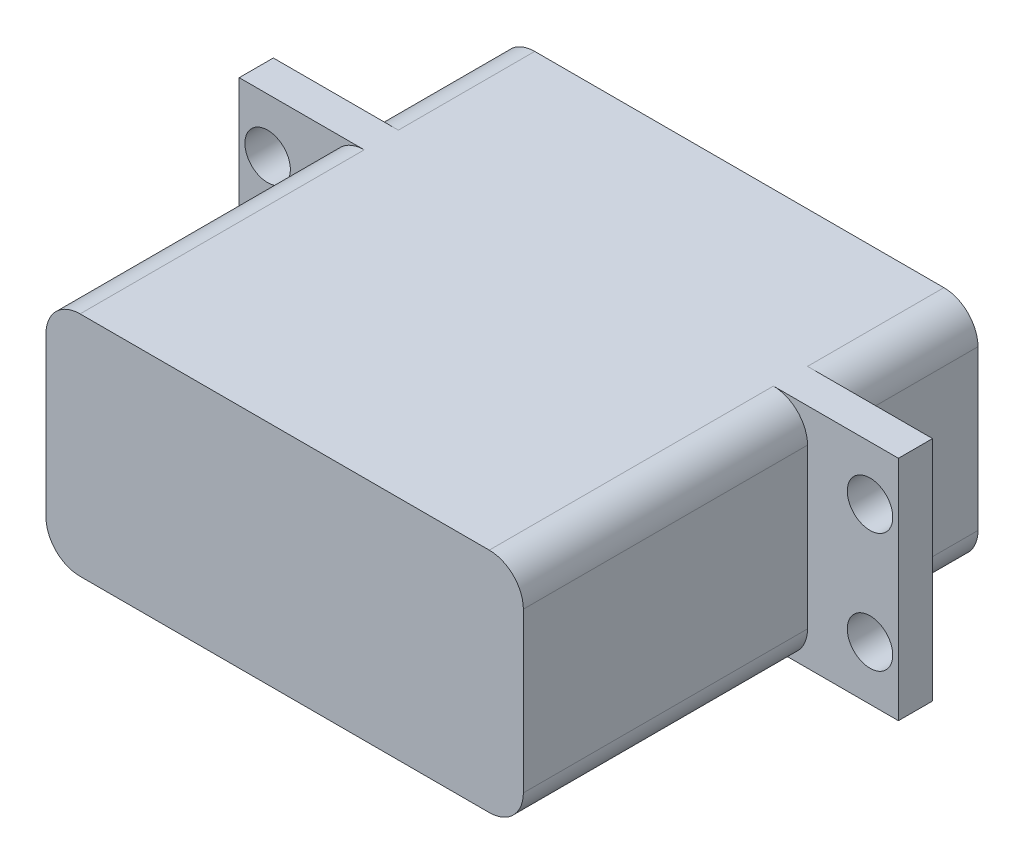
ISO-10303-21;
HEADER;
FILE_DESCRIPTION(('STEP AP214'),'2;1');
FILE_NAME('part.step','',(''),(''),'','','');
FILE_SCHEMA(('AUTOMOTIVE_DESIGN { 1 0 10303 214 1 1 1 1 }'));
ENDSEC;
DATA;
#1=APPLICATION_CONTEXT('core data for automotive mechanical design processes');
#2=APPLICATION_PROTOCOL_DEFINITION('international standard','automotive_design',2000,#1);
#3=PRODUCT_CONTEXT('',#1,'mechanical');
#4=PRODUCT('Part','Part','',(#3));
#5=PRODUCT_RELATED_PRODUCT_CATEGORY('part','',(#4));
#6=PRODUCT_DEFINITION_FORMATION('','',#4);
#7=PRODUCT_DEFINITION_CONTEXT('part definition',#1,'design');
#8=PRODUCT_DEFINITION('design','',#6,#7);
#9=PRODUCT_DEFINITION_SHAPE('','',#8);
#10=(LENGTH_UNIT() NAMED_UNIT(*) SI_UNIT(.MILLI.,.METRE.));
#11=(NAMED_UNIT(*) PLANE_ANGLE_UNIT() SI_UNIT($,.RADIAN.));
#12=(NAMED_UNIT(*) SI_UNIT($,.STERADIAN.) SOLID_ANGLE_UNIT());
#13=UNCERTAINTY_MEASURE_WITH_UNIT(LENGTH_MEASURE(1.E-05),#10,'distance_accuracy_value','');
#14=(GEOMETRIC_REPRESENTATION_CONTEXT(3) GLOBAL_UNCERTAINTY_ASSIGNED_CONTEXT((#13)) GLOBAL_UNIT_ASSIGNED_CONTEXT((#10,
#11,#12)) REPRESENTATION_CONTEXT('',''));
#15=CARTESIAN_POINT('',(0.,0.,0.));
#16=DIRECTION('',(0.,0.,1.));
#17=DIRECTION('',(1.,0.,0.));
#18=AXIS2_PLACEMENT_3D('',#15,#16,#17);
#19=CARTESIAN_POINT('',(39.,-17.,40.));
#20=DIRECTION('',(0.,0.,-1.));
#21=DIRECTION('',(-1.,0.,0.));
#22=AXIS2_PLACEMENT_3D('',#19,#20,#21);
#23=CYLINDRICAL_SURFACE('',#22,3.);
#24=CARTESIAN_POINT('',(39.,-17.,15.));
#25=DIRECTION('',(0.,0.,-1.));
#26=DIRECTION('',(-1.,0.,0.));
#27=AXIS2_PLACEMENT_3D('',#24,#25,#26);
#28=CIRCLE('',#27,3.);
#29=CARTESIAN_POINT('',(42.,-17.,15.));
#30=VERTEX_POINT('',#29);
#31=CARTESIAN_POINT('',(39.,-20.,15.));
#32=VERTEX_POINT('',#31);
#33=EDGE_CURVE('E56',#30,#32,#28,.T.);
#34=ORIENTED_EDGE('',*,*,#33,.F.);
#35=DIRECTION('',(0.,0.,-1.));
#36=VECTOR('',#35,1.);
#37=CARTESIAN_POINT('',(42.,-17.,40.));
#38=LINE('',#37,#36);
#39=CARTESIAN_POINT('',(42.,-17.,40.));
#40=VERTEX_POINT('',#39);
#41=EDGE_CURVE('E41',#40,#30,#38,.T.);
#42=ORIENTED_EDGE('',*,*,#41,.F.);
#43=CARTESIAN_POINT('',(39.,-17.,40.));
#44=DIRECTION('',(0.,0.,1.));
#45=DIRECTION('',(1.,0.,0.));
#46=AXIS2_PLACEMENT_3D('',#43,#44,#45);
#47=CIRCLE('',#46,3.);
#48=CARTESIAN_POINT('',(39.,-20.,40.));
#49=VERTEX_POINT('',#48);
#50=EDGE_CURVE('E251',#49,#40,#47,.T.);
#51=ORIENTED_EDGE('',*,*,#50,.F.);
#52=DIRECTION('',(0.,0.,-1.));
#53=VECTOR('',#52,1.);
#54=CARTESIAN_POINT('',(39.,-20.,40.));
#55=LINE('',#54,#53);
#56=EDGE_CURVE('E291',#49,#32,#55,.T.);
#57=ORIENTED_EDGE('',*,*,#56,.T.);
#58=EDGE_LOOP('',(#34,#42,#51,#57));
#59=FACE_BOUND('',#58,.T.);
#60=ADVANCED_FACE('F33',(#59),#23,.T.);
#61=CARTESIAN_POINT('',(42.,-3.00000000000002,40.));
#62=DIRECTION('',(-1.,0.,0.));
#63=DIRECTION('',(0.,0.,1.));
#64=AXIS2_PLACEMENT_3D('',#61,#62,#63);
#65=PLANE('',#64);
#66=DIRECTION('',(0.,-1.,0.));
#67=VECTOR('',#66,1.);
#68=CARTESIAN_POINT('',(42.,-3.00000000000002,15.));
#69=LINE('',#68,#67);
#70=CARTESIAN_POINT('',(42.,-3.00000000000002,15.));
#71=VERTEX_POINT('',#70);
#72=EDGE_CURVE('E351',#71,#30,#69,.T.);
#73=ORIENTED_EDGE('',*,*,#72,.F.);
#74=DIRECTION('',(0.,0.,-1.));
#75=VECTOR('',#74,1.);
#76=CARTESIAN_POINT('',(42.,-3.00000000000002,40.));
#77=LINE('',#76,#75);
#78=CARTESIAN_POINT('',(42.,-3.00000000000002,40.));
#79=VERTEX_POINT('',#78);
#80=EDGE_CURVE('E314',#79,#71,#77,.T.);
#81=ORIENTED_EDGE('',*,*,#80,.F.);
#82=DIRECTION('',(0.,1.,0.));
#83=VECTOR('',#82,1.);
#84=CARTESIAN_POINT('',(42.,-3.00000000000002,40.));
#85=LINE('',#84,#83);
#86=EDGE_CURVE('E254',#40,#79,#85,.T.);
#87=ORIENTED_EDGE('',*,*,#86,.F.);
#88=ORIENTED_EDGE('',*,*,#41,.T.);
#89=EDGE_LOOP('',(#73,#81,#87,#88));
#90=FACE_BOUND('',#89,.T.);
#91=ADVANCED_FACE('F407',(#90),#65,.F.);
#92=CARTESIAN_POINT('',(39.,-3.,40.));
#93=DIRECTION('',(0.,0.,-1.));
#94=DIRECTION('',(-1.,0.,0.));
#95=AXIS2_PLACEMENT_3D('',#92,#93,#94);
#96=CYLINDRICAL_SURFACE('',#95,3.);
#97=CARTESIAN_POINT('',(39.,-3.00000000000002,15.));
#98=DIRECTION('',(0.,0.,-1.));
#99=DIRECTION('',(-1.,0.,0.));
#100=AXIS2_PLACEMENT_3D('',#97,#98,#99);
#101=CIRCLE('',#100,3.00000000000002);
#102=CARTESIAN_POINT('',(39.,0.,15.));
#103=VERTEX_POINT('',#102);
#104=EDGE_CURVE('E215',#103,#71,#101,.T.);
#105=ORIENTED_EDGE('',*,*,#104,.F.);
#106=DIRECTION('',(0.,0.,-1.));
#107=VECTOR('',#106,1.);
#108=CARTESIAN_POINT('',(39.,0.,40.));
#109=LINE('',#108,#107);
#110=CARTESIAN_POINT('',(39.,0.,40.));
#111=VERTEX_POINT('',#110);
#112=EDGE_CURVE('E310',#111,#103,#109,.T.);
#113=ORIENTED_EDGE('',*,*,#112,.F.);
#114=CARTESIAN_POINT('',(39.,-3.,40.));
#115=DIRECTION('',(0.,0.,1.));
#116=DIRECTION('',(-1.,0.,0.));
#117=AXIS2_PLACEMENT_3D('',#114,#115,#116);
#118=CIRCLE('',#117,3.);
#119=EDGE_CURVE('E257',#79,#111,#118,.T.);
#120=ORIENTED_EDGE('',*,*,#119,.F.);
#121=ORIENTED_EDGE('',*,*,#80,.T.);
#122=EDGE_LOOP('',(#105,#113,#120,#121));
#123=FACE_BOUND('',#122,.T.);
#124=ADVANCED_FACE('F411',(#123),#96,.T.);
#125=CARTESIAN_POINT('',(3.,-3.,40.));
#126=DIRECTION('',(0.,0.,-1.));
#127=DIRECTION('',(-1.,0.,0.));
#128=AXIS2_PLACEMENT_3D('',#125,#126,#127);
#129=CYLINDRICAL_SURFACE('',#128,3.);
#130=CARTESIAN_POINT('',(3.00000000000002,-3.00000000000002,12.));
#131=DIRECTION('',(0.,0.,-1.));
#132=DIRECTION('',(1.,0.,0.));
#133=AXIS2_PLACEMENT_3D('',#130,#131,#132);
#134=CIRCLE('',#133,3.00000000000002);
#135=CARTESIAN_POINT('',(0.,-3.00000000000002,12.));
#136=VERTEX_POINT('',#135);
#137=CARTESIAN_POINT('',(3.00000000000002,0.,12.));
#138=VERTEX_POINT('',#137);
#139=EDGE_CURVE('E236',#136,#138,#134,.T.);
#140=ORIENTED_EDGE('',*,*,#139,.T.);
#141=DIRECTION('',(0.,0.,-1.));
#142=VECTOR('',#141,1.);
#143=CARTESIAN_POINT('',(3.00000000000002,0.,40.));
#144=LINE('',#143,#142);
#145=CARTESIAN_POINT('',(3.00000000000002,0.,0.));
#146=VERTEX_POINT('',#145);
#147=EDGE_CURVE('E305',#138,#146,#144,.T.);
#148=ORIENTED_EDGE('',*,*,#147,.T.);
#149=CARTESIAN_POINT('',(3.,-3.,0.));
#150=DIRECTION('',(0.,0.,1.));
#151=DIRECTION('',(1.,0.,0.));
#152=AXIS2_PLACEMENT_3D('',#149,#150,#151);
#153=CIRCLE('',#152,3.);
#154=CARTESIAN_POINT('',(0.,-3.00000000000002,0.));
#155=VERTEX_POINT('',#154);
#156=EDGE_CURVE('E281',#146,#155,#153,.T.);
#157=ORIENTED_EDGE('',*,*,#156,.T.);
#158=DIRECTION('',(0.,0.,-1.));
#159=VECTOR('',#158,1.);
#160=CARTESIAN_POINT('',(0.,-3.00000000000002,40.));
#161=LINE('',#160,#159);
#162=EDGE_CURVE('E301',#136,#155,#161,.T.);
#163=ORIENTED_EDGE('',*,*,#162,.F.);
#164=EDGE_LOOP('',(#140,#148,#157,#163));
#165=FACE_BOUND('',#164,.T.);
#166=ADVANCED_FACE('F339',(#165),#129,.T.);
#167=CARTESIAN_POINT('',(0.,-3.00000000000002,40.));
#168=DIRECTION('',(1.,0.,0.));
#169=DIRECTION('',(0.,1.,0.));
#170=AXIS2_PLACEMENT_3D('',#167,#168,#169);
#171=PLANE('',#170);
#172=DIRECTION('',(0.,1.,0.));
#173=VECTOR('',#172,1.);
#174=CARTESIAN_POINT('',(0.,-3.00000000000002,12.));
#175=LINE('',#174,#173);
#176=CARTESIAN_POINT('',(0.,-17.,12.));
#177=VERTEX_POINT('',#176);
#178=EDGE_CURVE('E233',#177,#136,#175,.T.);
#179=ORIENTED_EDGE('',*,*,#178,.T.);
#180=ORIENTED_EDGE('',*,*,#162,.T.);
#181=DIRECTION('',(0.,-1.,0.));
#182=VECTOR('',#181,1.);
#183=CARTESIAN_POINT('',(0.,-3.00000000000002,0.));
#184=LINE('',#183,#182);
#185=CARTESIAN_POINT('',(0.,-17.,0.));
#186=VERTEX_POINT('',#185);
#187=EDGE_CURVE('E284',#155,#186,#184,.T.);
#188=ORIENTED_EDGE('',*,*,#187,.T.);
#189=DIRECTION('',(0.,0.,-1.));
#190=VECTOR('',#189,1.);
#191=CARTESIAN_POINT('',(0.,-17.,40.));
#192=LINE('',#191,#190);
#193=EDGE_CURVE('E297',#177,#186,#192,.T.);
#194=ORIENTED_EDGE('',*,*,#193,.F.);
#195=EDGE_LOOP('',(#179,#180,#188,#194));
#196=FACE_BOUND('',#195,.T.);
#197=ADVANCED_FACE('F336',(#196),#171,.F.);
#198=CARTESIAN_POINT('',(3.,-17.,40.));
#199=DIRECTION('',(0.,0.,-1.));
#200=DIRECTION('',(-1.,0.,0.));
#201=AXIS2_PLACEMENT_3D('',#198,#199,#200);
#202=CYLINDRICAL_SURFACE('',#201,3.);
#203=CARTESIAN_POINT('',(3.,-17.,12.));
#204=DIRECTION('',(0.,0.,-1.));
#205=DIRECTION('',(1.,0.,0.));
#206=AXIS2_PLACEMENT_3D('',#203,#204,#205);
#207=CIRCLE('',#206,3.);
#208=CARTESIAN_POINT('',(3.00000000000002,-20.,12.));
#209=VERTEX_POINT('',#208);
#210=EDGE_CURVE('E191',#209,#177,#207,.T.);
#211=ORIENTED_EDGE('',*,*,#210,.T.);
#212=ORIENTED_EDGE('',*,*,#193,.T.);
#213=CARTESIAN_POINT('',(3.,-17.,0.));
#214=DIRECTION('',(0.,0.,1.));
#215=DIRECTION('',(-1.,0.,0.));
#216=AXIS2_PLACEMENT_3D('',#213,#214,#215);
#217=CIRCLE('',#216,3.);
#218=CARTESIAN_POINT('',(3.00000000000002,-20.,0.));
#219=VERTEX_POINT('',#218);
#220=EDGE_CURVE('E287',#186,#219,#217,.T.);
#221=ORIENTED_EDGE('',*,*,#220,.T.);
#222=DIRECTION('',(0.,0.,-1.));
#223=VECTOR('',#222,1.);
#224=CARTESIAN_POINT('',(3.00000000000002,-20.,40.));
#225=LINE('',#224,#223);
#226=EDGE_CURVE('E293',#209,#219,#225,.T.);
#227=ORIENTED_EDGE('',*,*,#226,.F.);
#228=EDGE_LOOP('',(#211,#212,#221,#227));
#229=FACE_BOUND('',#228,.T.);
#230=ADVANCED_FACE('F333',(#229),#202,.T.);
#231=CARTESIAN_POINT('',(42.,-17.,12.));
#232=VERTEX_POINT('',#231);
#233=CARTESIAN_POINT('',(42.,-17.,0.));
#234=VERTEX_POINT('',#233);
#235=EDGE_CURVE('E316',#232,#234,#38,.T.);
#236=ORIENTED_EDGE('',*,*,#235,.F.);
#237=CARTESIAN_POINT('',(39.,-17.,12.));
#238=DIRECTION('',(0.,0.,-1.));
#239=DIRECTION('',(-1.,0.,0.));
#240=AXIS2_PLACEMENT_3D('',#237,#238,#239);
#241=CIRCLE('',#240,3.);
#242=CARTESIAN_POINT('',(39.,-20.,12.));
#243=VERTEX_POINT('',#242);
#244=EDGE_CURVE('E206',#232,#243,#241,.T.);
#245=ORIENTED_EDGE('',*,*,#244,.T.);
#246=CARTESIAN_POINT('',(39.,-20.,0.));
#247=VERTEX_POINT('',#246);
#248=EDGE_CURVE('E269',#243,#247,#55,.T.);
#249=ORIENTED_EDGE('',*,*,#248,.T.);
#250=CARTESIAN_POINT('',(39.,-17.,0.));
#251=DIRECTION('',(0.,0.,1.));
#252=DIRECTION('',(1.,0.,0.));
#253=AXIS2_PLACEMENT_3D('',#250,#251,#252);
#254=CIRCLE('',#253,3.);
#255=EDGE_CURVE('E250',#247,#234,#254,.T.);
#256=ORIENTED_EDGE('',*,*,#255,.T.);
#257=EDGE_LOOP('',(#236,#245,#249,#256));
#258=FACE_BOUND('',#257,.T.);
#259=ADVANCED_FACE('F35',(#258),#23,.T.);
#260=CARTESIAN_POINT('',(42.,-3.00000000000002,12.));
#261=VERTEX_POINT('',#260);
#262=CARTESIAN_POINT('',(42.,-3.00000000000002,0.));
#263=VERTEX_POINT('',#262);
#264=EDGE_CURVE('E313',#261,#263,#77,.T.);
#265=ORIENTED_EDGE('',*,*,#264,.F.);
#266=DIRECTION('',(0.,-1.,0.));
#267=VECTOR('',#266,1.);
#268=CARTESIAN_POINT('',(42.,-3.00000000000002,12.));
#269=LINE('',#268,#267);
#270=EDGE_CURVE('E48',#261,#232,#269,.T.);
#271=ORIENTED_EDGE('',*,*,#270,.T.);
#272=ORIENTED_EDGE('',*,*,#235,.T.);
#273=DIRECTION('',(0.,1.,0.));
#274=VECTOR('',#273,1.);
#275=CARTESIAN_POINT('',(42.,-3.00000000000002,0.));
#276=LINE('',#275,#274);
#277=EDGE_CURVE('E272',#234,#263,#276,.T.);
#278=ORIENTED_EDGE('',*,*,#277,.T.);
#279=EDGE_LOOP('',(#265,#271,#272,#278));
#280=FACE_BOUND('',#279,.T.);
#281=ADVANCED_FACE('F319',(#280),#65,.F.);
#282=CARTESIAN_POINT('',(39.,0.,12.));
#283=VERTEX_POINT('',#282);
#284=CARTESIAN_POINT('',(39.,0.,0.));
#285=VERTEX_POINT('',#284);
#286=EDGE_CURVE('E309',#283,#285,#109,.T.);
#287=ORIENTED_EDGE('',*,*,#286,.F.);
#288=CARTESIAN_POINT('',(39.,-3.00000000000002,12.));
#289=DIRECTION('',(0.,0.,-1.));
#290=DIRECTION('',(-1.,0.,0.));
#291=AXIS2_PLACEMENT_3D('',#288,#289,#290);
#292=CIRCLE('',#291,3.00000000000002);
#293=EDGE_CURVE('E202',#283,#261,#292,.T.);
#294=ORIENTED_EDGE('',*,*,#293,.T.);
#295=ORIENTED_EDGE('',*,*,#264,.T.);
#296=CARTESIAN_POINT('',(39.,-3.,0.));
#297=DIRECTION('',(0.,0.,1.));
#298=DIRECTION('',(-1.,0.,0.));
#299=AXIS2_PLACEMENT_3D('',#296,#297,#298);
#300=CIRCLE('',#299,3.);
#301=EDGE_CURVE('E275',#263,#285,#300,.T.);
#302=ORIENTED_EDGE('',*,*,#301,.T.);
#303=EDGE_LOOP('',(#287,#294,#295,#302));
#304=FACE_BOUND('',#303,.T.);
#305=ADVANCED_FACE('F346',(#304),#96,.T.);
#306=CARTESIAN_POINT('',(3.00000000000002,0.,40.));
#307=DIRECTION('',(0.,-1.,0.));
#308=DIRECTION('',(0.,0.,-1.));
#309=AXIS2_PLACEMENT_3D('',#306,#307,#308);
#310=PLANE('',#309);
#311=DIRECTION('',(-1.,0.,0.));
#312=VECTOR('',#311,1.);
#313=CARTESIAN_POINT('',(3.00000000000002,0.,0.));
#314=LINE('',#313,#312);
#315=EDGE_CURVE('E278',#285,#146,#314,.T.);
#316=ORIENTED_EDGE('',*,*,#315,.T.);
#317=ORIENTED_EDGE('',*,*,#147,.F.);
#318=DIRECTION('',(-1.,0.,0.));
#319=VECTOR('',#318,1.);
#320=CARTESIAN_POINT('',(3.00000000000002,0.,12.));
#321=LINE('',#320,#319);
#322=CARTESIAN_POINT('',(-8.,0.,12.));
#323=VERTEX_POINT('',#322);
#324=EDGE_CURVE('E239',#138,#323,#321,.T.);
#325=ORIENTED_EDGE('',*,*,#324,.T.);
#326=DIRECTION('',(0.,0.,-1.));
#327=VECTOR('',#326,1.);
#328=CARTESIAN_POINT('',(-8.,0.,15.));
#329=LINE('',#328,#327);
#330=CARTESIAN_POINT('',(-8.,0.,15.));
#331=VERTEX_POINT('',#330);
#332=EDGE_CURVE('E247',#331,#323,#329,.T.);
#333=ORIENTED_EDGE('',*,*,#332,.F.);
#334=DIRECTION('',(-1.,0.,0.));
#335=VECTOR('',#334,1.);
#336=CARTESIAN_POINT('',(3.00000000000002,0.,15.));
#337=LINE('',#336,#335);
#338=CARTESIAN_POINT('',(3.00000000000002,0.,15.));
#339=VERTEX_POINT('',#338);
#340=EDGE_CURVE('E224',#339,#331,#337,.T.);
#341=ORIENTED_EDGE('',*,*,#340,.F.);
#342=CARTESIAN_POINT('',(3.00000000000002,0.,40.));
#343=VERTEX_POINT('',#342);
#344=EDGE_CURVE('E306',#343,#339,#144,.T.);
#345=ORIENTED_EDGE('',*,*,#344,.F.);
#346=DIRECTION('',(-1.,0.,0.));
#347=VECTOR('',#346,1.);
#348=CARTESIAN_POINT('',(3.00000000000002,0.,40.));
#349=LINE('',#348,#347);
#350=EDGE_CURVE('E259',#111,#343,#349,.T.);
#351=ORIENTED_EDGE('',*,*,#350,.F.);
#352=ORIENTED_EDGE('',*,*,#112,.T.);
#353=DIRECTION('',(-1.,0.,0.));
#354=VECTOR('',#353,1.);
#355=CARTESIAN_POINT('',(39.,0.,15.));
#356=LINE('',#355,#354);
#357=CARTESIAN_POINT('',(50.,0.,15.));
#358=VERTEX_POINT('',#357);
#359=EDGE_CURVE('E197',#358,#103,#356,.T.);
#360=ORIENTED_EDGE('',*,*,#359,.F.);
#361=DIRECTION('',(0.,0.,-1.));
#362=VECTOR('',#361,1.);
#363=CARTESIAN_POINT('',(50.,0.,15.));
#364=LINE('',#363,#362);
#365=CARTESIAN_POINT('',(50.,0.,12.));
#366=VERTEX_POINT('',#365);
#367=EDGE_CURVE('E192',#358,#366,#364,.T.);
#368=ORIENTED_EDGE('',*,*,#367,.T.);
#369=DIRECTION('',(-1.,0.,0.));
#370=VECTOR('',#369,1.);
#371=CARTESIAN_POINT('',(39.,0.,12.));
#372=LINE('',#371,#370);
#373=EDGE_CURVE('E212',#366,#283,#372,.T.);
#374=ORIENTED_EDGE('',*,*,#373,.T.);
#375=ORIENTED_EDGE('',*,*,#286,.T.);
#376=EDGE_LOOP('',(#316,#317,#325,#333,#341,#345,#351,#352,#360,#368,#374,#375));
#377=FACE_BOUND('',#376,.T.);
#378=ADVANCED_FACE('F342',(#377),#310,.F.);
#379=ORIENTED_EDGE('',*,*,#344,.T.);
#380=CARTESIAN_POINT('',(3.00000000000002,-3.00000000000002,15.));
#381=DIRECTION('',(0.,0.,-1.));
#382=DIRECTION('',(1.,0.,0.));
#383=AXIS2_PLACEMENT_3D('',#380,#381,#382);
#384=CIRCLE('',#383,3.00000000000002);
#385=CARTESIAN_POINT('',(0.,-3.00000000000002,15.));
#386=VERTEX_POINT('',#385);
#387=EDGE_CURVE('E222',#386,#339,#384,.T.);
#388=ORIENTED_EDGE('',*,*,#387,.F.);
#389=CARTESIAN_POINT('',(0.,-3.00000000000002,40.));
#390=VERTEX_POINT('',#389);
#391=EDGE_CURVE('E302',#390,#386,#161,.T.);
#392=ORIENTED_EDGE('',*,*,#391,.F.);
#393=CARTESIAN_POINT('',(3.,-3.,40.));
#394=DIRECTION('',(0.,0.,1.));
#395=DIRECTION('',(1.,0.,0.));
#396=AXIS2_PLACEMENT_3D('',#393,#394,#395);
#397=CIRCLE('',#396,3.);
#398=EDGE_CURVE('E261',#343,#390,#397,.T.);
#399=ORIENTED_EDGE('',*,*,#398,.F.);
#400=EDGE_LOOP('',(#379,#388,#392,#399));
#401=FACE_BOUND('',#400,.T.);
#402=ADVANCED_FACE('F430',(#401),#129,.T.);
#403=ORIENTED_EDGE('',*,*,#391,.T.);
#404=DIRECTION('',(0.,1.,0.));
#405=VECTOR('',#404,1.);
#406=CARTESIAN_POINT('',(0.,-3.00000000000002,15.));
#407=LINE('',#406,#405);
#408=CARTESIAN_POINT('',(0.,-17.,15.));
#409=VERTEX_POINT('',#408);
#410=EDGE_CURVE('E219',#409,#386,#407,.T.);
#411=ORIENTED_EDGE('',*,*,#410,.F.);
#412=CARTESIAN_POINT('',(0.,-17.,40.));
#413=VERTEX_POINT('',#412);
#414=EDGE_CURVE('E298',#413,#409,#192,.T.);
#415=ORIENTED_EDGE('',*,*,#414,.F.);
#416=DIRECTION('',(0.,-1.,0.));
#417=VECTOR('',#416,1.);
#418=CARTESIAN_POINT('',(0.,-3.00000000000002,40.));
#419=LINE('',#418,#417);
#420=EDGE_CURVE('E263',#390,#413,#419,.T.);
#421=ORIENTED_EDGE('',*,*,#420,.F.);
#422=EDGE_LOOP('',(#403,#411,#415,#421));
#423=FACE_BOUND('',#422,.T.);
#424=ADVANCED_FACE('F423',(#423),#171,.F.);
#425=ORIENTED_EDGE('',*,*,#414,.T.);
#426=CARTESIAN_POINT('',(3.,-17.,15.));
#427=DIRECTION('',(0.,0.,-1.));
#428=DIRECTION('',(1.,0.,0.));
#429=AXIS2_PLACEMENT_3D('',#426,#427,#428);
#430=CIRCLE('',#429,3.);
#431=CARTESIAN_POINT('',(3.00000000000002,-20.,15.));
#432=VERTEX_POINT('',#431);
#433=EDGE_CURVE('E217',#432,#409,#430,.T.);
#434=ORIENTED_EDGE('',*,*,#433,.F.);
#435=CARTESIAN_POINT('',(3.00000000000002,-20.,40.));
#436=VERTEX_POINT('',#435);
#437=EDGE_CURVE('E294',#436,#432,#225,.T.);
#438=ORIENTED_EDGE('',*,*,#437,.F.);
#439=CARTESIAN_POINT('',(3.,-17.,40.));
#440=DIRECTION('',(0.,0.,1.));
#441=DIRECTION('',(-1.,0.,0.));
#442=AXIS2_PLACEMENT_3D('',#439,#440,#441);
#443=CIRCLE('',#442,3.);
#444=EDGE_CURVE('E265',#413,#436,#443,.T.);
#445=ORIENTED_EDGE('',*,*,#444,.F.);
#446=EDGE_LOOP('',(#425,#434,#438,#445));
#447=FACE_BOUND('',#446,.T.);
#448=ADVANCED_FACE('F418',(#447),#202,.T.);
#449=CARTESIAN_POINT('',(3.00000000000002,-20.,40.));
#450=DIRECTION('',(0.,1.,0.));
#451=DIRECTION('',(0.,0.,1.));
#452=AXIS2_PLACEMENT_3D('',#449,#450,#451);
#453=PLANE('',#452);
#454=DIRECTION('',(1.,0.,0.));
#455=VECTOR('',#454,1.);
#456=CARTESIAN_POINT('',(3.00000000000002,-20.,0.));
#457=LINE('',#456,#455);
#458=EDGE_CURVE('E255',#219,#247,#457,.T.);
#459=ORIENTED_EDGE('',*,*,#458,.T.);
#460=ORIENTED_EDGE('',*,*,#248,.F.);
#461=DIRECTION('',(1.,0.,0.));
#462=VECTOR('',#461,1.);
#463=CARTESIAN_POINT('',(50.,-20.,12.));
#464=LINE('',#463,#462);
#465=CARTESIAN_POINT('',(50.,-20.,12.));
#466=VERTEX_POINT('',#465);
#467=EDGE_CURVE('E188',#243,#466,#464,.T.);
#468=ORIENTED_EDGE('',*,*,#467,.T.);
#469=DIRECTION('',(0.,0.,-1.));
#470=VECTOR('',#469,1.);
#471=CARTESIAN_POINT('',(50.,-20.,15.));
#472=LINE('',#471,#470);
#473=CARTESIAN_POINT('',(50.,-20.,15.));
#474=VERTEX_POINT('',#473);
#475=EDGE_CURVE('E184',#474,#466,#472,.T.);
#476=ORIENTED_EDGE('',*,*,#475,.F.);
#477=DIRECTION('',(1.,0.,0.));
#478=VECTOR('',#477,1.);
#479=CARTESIAN_POINT('',(50.,-20.,15.));
#480=LINE('',#479,#478);
#481=EDGE_CURVE('E171',#32,#474,#480,.T.);
#482=ORIENTED_EDGE('',*,*,#481,.F.);
#483=ORIENTED_EDGE('',*,*,#56,.F.);
#484=DIRECTION('',(1.,0.,0.));
#485=VECTOR('',#484,1.);
#486=CARTESIAN_POINT('',(3.00000000000002,-20.,40.));
#487=LINE('',#486,#485);
#488=EDGE_CURVE('E267',#436,#49,#487,.T.);
#489=ORIENTED_EDGE('',*,*,#488,.F.);
#490=ORIENTED_EDGE('',*,*,#437,.T.);
#491=DIRECTION('',(1.,0.,0.));
#492=VECTOR('',#491,1.);
#493=CARTESIAN_POINT('',(-8.,-20.,15.));
#494=LINE('',#493,#492);
#495=CARTESIAN_POINT('',(-8.,-20.,15.));
#496=VERTEX_POINT('',#495);
#497=EDGE_CURVE('E228',#496,#432,#494,.T.);
#498=ORIENTED_EDGE('',*,*,#497,.F.);
#499=DIRECTION('',(0.,0.,-1.));
#500=VECTOR('',#499,1.);
#501=CARTESIAN_POINT('',(-8.,-20.,15.));
#502=LINE('',#501,#500);
#503=CARTESIAN_POINT('',(-8.,-20.,12.));
#504=VERTEX_POINT('',#503);
#505=EDGE_CURVE('E230',#496,#504,#502,.T.);
#506=ORIENTED_EDGE('',*,*,#505,.T.);
#507=DIRECTION('',(1.,0.,0.));
#508=VECTOR('',#507,1.);
#509=CARTESIAN_POINT('',(-8.,-20.,12.));
#510=LINE('',#509,#508);
#511=EDGE_CURVE('E220',#504,#209,#510,.T.);
#512=ORIENTED_EDGE('',*,*,#511,.T.);
#513=ORIENTED_EDGE('',*,*,#226,.T.);
#514=EDGE_LOOP('',(#459,#460,#468,#476,#482,#483,#489,#490,#498,#506,#512,#513));
#515=FACE_BOUND('',#514,.T.);
#516=ADVANCED_FACE('F186',(#515),#453,.F.);
#517=CARTESIAN_POINT('',(39.,-17.,40.));
#518=DIRECTION('',(0.,0.,1.));
#519=DIRECTION('',(1.,0.,0.));
#520=AXIS2_PLACEMENT_3D('',#517,#518,#519);
#521=PLANE('',#520);
#522=ORIENTED_EDGE('',*,*,#50,.T.);
#523=ORIENTED_EDGE('',*,*,#86,.T.);
#524=ORIENTED_EDGE('',*,*,#119,.T.);
#525=ORIENTED_EDGE('',*,*,#350,.T.);
#526=ORIENTED_EDGE('',*,*,#398,.T.);
#527=ORIENTED_EDGE('',*,*,#420,.T.);
#528=ORIENTED_EDGE('',*,*,#444,.T.);
#529=ORIENTED_EDGE('',*,*,#488,.T.);
#530=EDGE_LOOP('',(#522,#523,#524,#525,#526,#527,#528,#529));
#531=FACE_BOUND('',#530,.T.);
#532=ADVANCED_FACE('F394',(#531),#521,.T.);
#533=CARTESIAN_POINT('',(39.,-17.,0.));
#534=DIRECTION('',(0.,0.,1.));
#535=DIRECTION('',(1.,0.,0.));
#536=AXIS2_PLACEMENT_3D('',#533,#534,#535);
#537=PLANE('',#536);
#538=CARTESIAN_POINT('',(10.,-10.,0.));
#539=DIRECTION('',(0.,0.,1.));
#540=DIRECTION('',(1.,0.,0.));
#541=AXIS2_PLACEMENT_3D('',#538,#539,#540);
#542=CIRCLE('',#541,3.);
#543=CARTESIAN_POINT('',(13.,-10.,0.));
#544=VERTEX_POINT('',#543);
#545=EDGE_CURVE('E11',#544,#544,#542,.F.);
#546=ORIENTED_EDGE('',*,*,#545,.F.);
#547=EDGE_LOOP('',(#546));
#548=FACE_BOUND('',#547,.T.);
#549=ORIENTED_EDGE('',*,*,#255,.F.);
#550=ORIENTED_EDGE('',*,*,#458,.F.);
#551=ORIENTED_EDGE('',*,*,#220,.F.);
#552=ORIENTED_EDGE('',*,*,#187,.F.);
#553=ORIENTED_EDGE('',*,*,#156,.F.);
#554=ORIENTED_EDGE('',*,*,#315,.F.);
#555=ORIENTED_EDGE('',*,*,#301,.F.);
#556=ORIENTED_EDGE('',*,*,#277,.F.);
#557=EDGE_LOOP('',(#549,#550,#551,#552,#553,#554,#555,#556));
#558=FACE_BOUND('',#557,.T.);
#559=ADVANCED_FACE('F325',(#548,#558),#537,.F.);
#560=CARTESIAN_POINT('',(-8.,0.,15.));
#561=DIRECTION('',(1.,0.,0.));
#562=DIRECTION('',(0.,0.,-1.));
#563=AXIS2_PLACEMENT_3D('',#560,#561,#562);
#564=PLANE('',#563);
#565=DIRECTION('',(0.,-1.,0.));
#566=VECTOR('',#565,1.);
#567=CARTESIAN_POINT('',(-8.,0.,12.));
#568=LINE('',#567,#566);
#569=EDGE_CURVE('E241',#323,#504,#568,.T.);
#570=ORIENTED_EDGE('',*,*,#569,.T.);
#571=ORIENTED_EDGE('',*,*,#505,.F.);
#572=DIRECTION('',(0.,-1.,0.));
#573=VECTOR('',#572,1.);
#574=CARTESIAN_POINT('',(-8.,0.,15.));
#575=LINE('',#574,#573);
#576=EDGE_CURVE('E226',#331,#496,#575,.T.);
#577=ORIENTED_EDGE('',*,*,#576,.F.);
#578=ORIENTED_EDGE('',*,*,#332,.T.);
#579=EDGE_LOOP('',(#570,#571,#577,#578));
#580=FACE_BOUND('',#579,.T.);
#581=ADVANCED_FACE('F393',(#580),#564,.F.);
#582=CARTESIAN_POINT('',(3.,-17.,15.));
#583=DIRECTION('',(0.,0.,1.));
#584=DIRECTION('',(1.,0.,0.));
#585=AXIS2_PLACEMENT_3D('',#582,#583,#584);
#586=PLANE('',#585);
#587=CARTESIAN_POINT('',(-5.50000000000002,-15.25,15.));
#588=DIRECTION('',(0.,0.,-1.));
#589=DIRECTION('',(-1.,0.,0.));
#590=AXIS2_PLACEMENT_3D('',#587,#588,#589);
#591=CIRCLE('',#590,2.);
#592=CARTESIAN_POINT('',(-7.50000000000002,-15.25,15.));
#593=VERTEX_POINT('',#592);
#594=EDGE_CURVE('E359',#593,#593,#591,.T.);
#595=ORIENTED_EDGE('',*,*,#594,.T.);
#596=EDGE_LOOP('',(#595));
#597=FACE_BOUND('',#596,.T.);
#598=CARTESIAN_POINT('',(-5.5,-4.75,15.));
#599=DIRECTION('',(0.,0.,-1.));
#600=DIRECTION('',(-1.,0.,0.));
#601=AXIS2_PLACEMENT_3D('',#598,#599,#600);
#602=CIRCLE('',#601,2.);
#603=CARTESIAN_POINT('',(-7.5,-4.75,15.));
#604=VERTEX_POINT('',#603);
#605=EDGE_CURVE('E204',#604,#604,#602,.T.);
#606=ORIENTED_EDGE('',*,*,#605,.T.);
#607=EDGE_LOOP('',(#606));
#608=FACE_BOUND('',#607,.T.);
#609=ORIENTED_EDGE('',*,*,#433,.T.);
#610=ORIENTED_EDGE('',*,*,#410,.T.);
#611=ORIENTED_EDGE('',*,*,#387,.T.);
#612=ORIENTED_EDGE('',*,*,#340,.T.);
#613=ORIENTED_EDGE('',*,*,#576,.T.);
#614=ORIENTED_EDGE('',*,*,#497,.T.);
#615=EDGE_LOOP('',(#609,#610,#611,#612,#613,#614));
#616=FACE_BOUND('',#615,.T.);
#617=ADVANCED_FACE('F400',(#597,#608,#616),#586,.T.);
#618=CARTESIAN_POINT('',(3.,-17.,12.));
#619=DIRECTION('',(0.,0.,1.));
#620=DIRECTION('',(1.,0.,0.));
#621=AXIS2_PLACEMENT_3D('',#618,#619,#620);
#622=PLANE('',#621);
#623=CARTESIAN_POINT('',(-5.50000000000002,-15.25,12.));
#624=DIRECTION('',(0.,0.,-1.));
#625=DIRECTION('',(-1.,0.,0.));
#626=AXIS2_PLACEMENT_3D('',#623,#624,#625);
#627=CIRCLE('',#626,2.);
#628=CARTESIAN_POINT('',(-7.50000000000002,-15.25,12.));
#629=VERTEX_POINT('',#628);
#630=EDGE_CURVE('E369',#629,#629,#627,.T.);
#631=ORIENTED_EDGE('',*,*,#630,.F.);
#632=EDGE_LOOP('',(#631));
#633=FACE_BOUND('',#632,.T.);
#634=CARTESIAN_POINT('',(-5.5,-4.75,12.));
#635=DIRECTION('',(0.,0.,-1.));
#636=DIRECTION('',(-1.,0.,0.));
#637=AXIS2_PLACEMENT_3D('',#634,#635,#636);
#638=CIRCLE('',#637,2.);
#639=CARTESIAN_POINT('',(-7.5,-4.75,12.));
#640=VERTEX_POINT('',#639);
#641=EDGE_CURVE('E356',#640,#640,#638,.T.);
#642=ORIENTED_EDGE('',*,*,#641,.F.);
#643=EDGE_LOOP('',(#642));
#644=FACE_BOUND('',#643,.T.);
#645=ORIENTED_EDGE('',*,*,#210,.F.);
#646=ORIENTED_EDGE('',*,*,#511,.F.);
#647=ORIENTED_EDGE('',*,*,#569,.F.);
#648=ORIENTED_EDGE('',*,*,#324,.F.);
#649=ORIENTED_EDGE('',*,*,#139,.F.);
#650=ORIENTED_EDGE('',*,*,#178,.F.);
#651=EDGE_LOOP('',(#645,#646,#647,#648,#649,#650));
#652=FACE_BOUND('',#651,.T.);
#653=ADVANCED_FACE('F504',(#633,#644,#652),#622,.F.);
#654=CARTESIAN_POINT('',(50.,0.,15.));
#655=DIRECTION('',(-1.,0.,0.));
#656=DIRECTION('',(0.,0.,1.));
#657=AXIS2_PLACEMENT_3D('',#654,#655,#656);
#658=PLANE('',#657);
#659=DIRECTION('',(0.,1.,0.));
#660=VECTOR('',#659,1.);
#661=CARTESIAN_POINT('',(50.,0.,12.));
#662=LINE('',#661,#660);
#663=EDGE_CURVE('E210',#466,#366,#662,.T.);
#664=ORIENTED_EDGE('',*,*,#663,.T.);
#665=ORIENTED_EDGE('',*,*,#367,.F.);
#666=DIRECTION('',(0.,1.,0.));
#667=VECTOR('',#666,1.);
#668=CARTESIAN_POINT('',(50.,0.,15.));
#669=LINE('',#668,#667);
#670=EDGE_CURVE('E177',#474,#358,#669,.T.);
#671=ORIENTED_EDGE('',*,*,#670,.F.);
#672=ORIENTED_EDGE('',*,*,#475,.T.);
#673=EDGE_LOOP('',(#664,#665,#671,#672));
#674=FACE_BOUND('',#673,.T.);
#675=ADVANCED_FACE('F194',(#674),#658,.F.);
#676=CARTESIAN_POINT('',(39.,-3.00000000000002,15.));
#677=DIRECTION('',(0.,0.,-1.));
#678=DIRECTION('',(-1.,0.,0.));
#679=AXIS2_PLACEMENT_3D('',#676,#677,#678);
#680=PLANE('',#679);
#681=CARTESIAN_POINT('',(47.5,-4.75,15.));
#682=DIRECTION('',(0.,0.,-1.));
#683=DIRECTION('',(-1.,0.,0.));
#684=AXIS2_PLACEMENT_3D('',#681,#682,#683);
#685=CIRCLE('',#684,2.);
#686=CARTESIAN_POINT('',(45.5,-4.75,15.));
#687=VERTEX_POINT('',#686);
#688=EDGE_CURVE('E365',#687,#687,#685,.F.);
#689=ORIENTED_EDGE('',*,*,#688,.F.);
#690=EDGE_LOOP('',(#689));
#691=FACE_BOUND('',#690,.T.);
#692=CARTESIAN_POINT('',(47.5,-15.25,15.));
#693=DIRECTION('',(0.,0.,-1.));
#694=DIRECTION('',(-1.,0.,0.));
#695=AXIS2_PLACEMENT_3D('',#692,#693,#694);
#696=CIRCLE('',#695,2.);
#697=CARTESIAN_POINT('',(45.5,-15.25,15.));
#698=VERTEX_POINT('',#697);
#699=EDGE_CURVE('E366',#698,#698,#696,.F.);
#700=ORIENTED_EDGE('',*,*,#699,.F.);
#701=EDGE_LOOP('',(#700));
#702=FACE_BOUND('',#701,.T.);
#703=ORIENTED_EDGE('',*,*,#104,.T.);
#704=ORIENTED_EDGE('',*,*,#72,.T.);
#705=ORIENTED_EDGE('',*,*,#33,.T.);
#706=ORIENTED_EDGE('',*,*,#481,.T.);
#707=ORIENTED_EDGE('',*,*,#670,.T.);
#708=ORIENTED_EDGE('',*,*,#359,.T.);
#709=EDGE_LOOP('',(#703,#704,#705,#706,#707,#708));
#710=FACE_BOUND('',#709,.T.);
#711=ADVANCED_FACE('F174',(#691,#702,#710),#680,.F.);
#712=CARTESIAN_POINT('',(39.,-3.00000000000002,12.));
#713=DIRECTION('',(0.,0.,-1.));
#714=DIRECTION('',(-1.,0.,0.));
#715=AXIS2_PLACEMENT_3D('',#712,#713,#714);
#716=PLANE('',#715);
#717=CARTESIAN_POINT('',(47.5,-4.75,12.));
#718=DIRECTION('',(0.,0.,-1.));
#719=DIRECTION('',(-1.,0.,0.));
#720=AXIS2_PLACEMENT_3D('',#717,#718,#719);
#721=CIRCLE('',#720,2.);
#722=CARTESIAN_POINT('',(45.5,-4.75,12.));
#723=VERTEX_POINT('',#722);
#724=EDGE_CURVE('E362',#723,#723,#721,.F.);
#725=ORIENTED_EDGE('',*,*,#724,.T.);
#726=EDGE_LOOP('',(#725));
#727=FACE_BOUND('',#726,.T.);
#728=CARTESIAN_POINT('',(47.5,-15.25,12.));
#729=DIRECTION('',(0.,0.,-1.));
#730=DIRECTION('',(-1.,0.,0.));
#731=AXIS2_PLACEMENT_3D('',#728,#729,#730);
#732=CIRCLE('',#731,2.);
#733=CARTESIAN_POINT('',(45.5,-15.25,12.));
#734=VERTEX_POINT('',#733);
#735=EDGE_CURVE('E374',#734,#734,#732,.F.);
#736=ORIENTED_EDGE('',*,*,#735,.T.);
#737=EDGE_LOOP('',(#736));
#738=FACE_BOUND('',#737,.T.);
#739=ORIENTED_EDGE('',*,*,#293,.F.);
#740=ORIENTED_EDGE('',*,*,#373,.F.);
#741=ORIENTED_EDGE('',*,*,#663,.F.);
#742=ORIENTED_EDGE('',*,*,#467,.F.);
#743=ORIENTED_EDGE('',*,*,#244,.F.);
#744=ORIENTED_EDGE('',*,*,#270,.F.);
#745=EDGE_LOOP('',(#739,#740,#741,#742,#743,#744));
#746=FACE_BOUND('',#745,.T.);
#747=ADVANCED_FACE('F348',(#727,#738,#746),#716,.T.);
#748=CARTESIAN_POINT('',(47.5,-15.25,15.));
#749=DIRECTION('',(0.,0.,-1.));
#750=DIRECTION('',(-1.,0.,0.));
#751=AXIS2_PLACEMENT_3D('',#748,#749,#750);
#752=CYLINDRICAL_SURFACE('',#751,2.);
#753=ORIENTED_EDGE('',*,*,#699,.T.);
#754=EDGE_LOOP('',(#753));
#755=FACE_BOUND('',#754,.T.);
#756=ORIENTED_EDGE('',*,*,#735,.F.);
#757=EDGE_LOOP('',(#756));
#758=FACE_BOUND('',#757,.T.);
#759=ADVANCED_FACE('F538',(#755,#758),#752,.F.);
#760=CARTESIAN_POINT('',(47.5,-4.75,15.));
#761=DIRECTION('',(0.,0.,-1.));
#762=DIRECTION('',(-1.,0.,0.));
#763=AXIS2_PLACEMENT_3D('',#760,#761,#762);
#764=CYLINDRICAL_SURFACE('',#763,2.);
#765=ORIENTED_EDGE('',*,*,#688,.T.);
#766=EDGE_LOOP('',(#765));
#767=FACE_BOUND('',#766,.T.);
#768=ORIENTED_EDGE('',*,*,#724,.F.);
#769=EDGE_LOOP('',(#768));
#770=FACE_BOUND('',#769,.T.);
#771=ADVANCED_FACE('F548',(#767,#770),#764,.F.);
#772=CARTESIAN_POINT('',(-5.5,-4.75,15.));
#773=DIRECTION('',(0.,0.,-1.));
#774=DIRECTION('',(-1.,0.,0.));
#775=AXIS2_PLACEMENT_3D('',#772,#773,#774);
#776=CYLINDRICAL_SURFACE('',#775,2.);
#777=ORIENTED_EDGE('',*,*,#605,.F.);
#778=EDGE_LOOP('',(#777));
#779=FACE_BOUND('',#778,.T.);
#780=ORIENTED_EDGE('',*,*,#641,.T.);
#781=EDGE_LOOP('',(#780));
#782=FACE_BOUND('',#781,.T.);
#783=ADVANCED_FACE('F558',(#779,#782),#776,.F.);
#784=CARTESIAN_POINT('',(-5.50000000000002,-15.25,15.));
#785=DIRECTION('',(0.,0.,-1.));
#786=DIRECTION('',(-1.,0.,0.));
#787=AXIS2_PLACEMENT_3D('',#784,#785,#786);
#788=CYLINDRICAL_SURFACE('',#787,2.);
#789=ORIENTED_EDGE('',*,*,#594,.F.);
#790=EDGE_LOOP('',(#789));
#791=FACE_BOUND('',#790,.T.);
#792=ORIENTED_EDGE('',*,*,#630,.T.);
#793=EDGE_LOOP('',(#792));
#794=FACE_BOUND('',#793,.T.);
#795=ADVANCED_FACE('F388',(#791,#794),#788,.F.);
#796=CARTESIAN_POINT('',(10.,-10.,-5.5));
#797=DIRECTION('',(0.,0.,1.));
#798=DIRECTION('',(1.,0.,0.));
#799=AXIS2_PLACEMENT_3D('',#796,#797,#798);
#800=CYLINDRICAL_SURFACE('',#799,3.);
#801=CARTESIAN_POINT('',(10.,-10.,-5.5));
#802=DIRECTION('',(0.,0.,-1.));
#803=DIRECTION('',(-1.,0.,0.));
#804=AXIS2_PLACEMENT_3D('',#801,#802,#803);
#805=CIRCLE('',#804,3.);
#806=CARTESIAN_POINT('',(7.,-10.,-5.5));
#807=VERTEX_POINT('',#806);
#808=EDGE_CURVE('E377',#807,#807,#805,.T.);
#809=ORIENTED_EDGE('',*,*,#808,.F.);
#810=EDGE_LOOP('',(#809));
#811=FACE_BOUND('',#810,.T.);
#812=ORIENTED_EDGE('',*,*,#545,.T.);
#813=EDGE_LOOP('',(#812));
#814=FACE_BOUND('',#813,.T.);
#815=ADVANCED_FACE('F385',(#811,#814),#800,.T.);
#816=CARTESIAN_POINT('',(10.,-10.,-5.5));
#817=DIRECTION('',(0.,0.,-1.));
#818=DIRECTION('',(-1.,0.,0.));
#819=AXIS2_PLACEMENT_3D('',#816,#817,#818);
#820=PLANE('',#819);
#821=ORIENTED_EDGE('',*,*,#808,.T.);
#822=EDGE_LOOP('',(#821));
#823=FACE_BOUND('',#822,.T.);
#824=ADVANCED_FACE('F383',(#823),#820,.T.);
#825=CLOSED_SHELL('',(#60,#91,#124,#166,#197,#230,#259,#281,#305,#378,#402,#424,#448,#516,#532,
#559,#581,#617,#653,#675,#711,#747,#759,#771,#783,#795,#815,#824));
#826=MANIFOLD_SOLID_BREP('B2',#825);
#827=ADVANCED_BREP_SHAPE_REPRESENTATION('',(#18,#826),#14);
#828=SHAPE_DEFINITION_REPRESENTATION(#9,#827);
ENDSEC;
END-ISO-10303-21;
